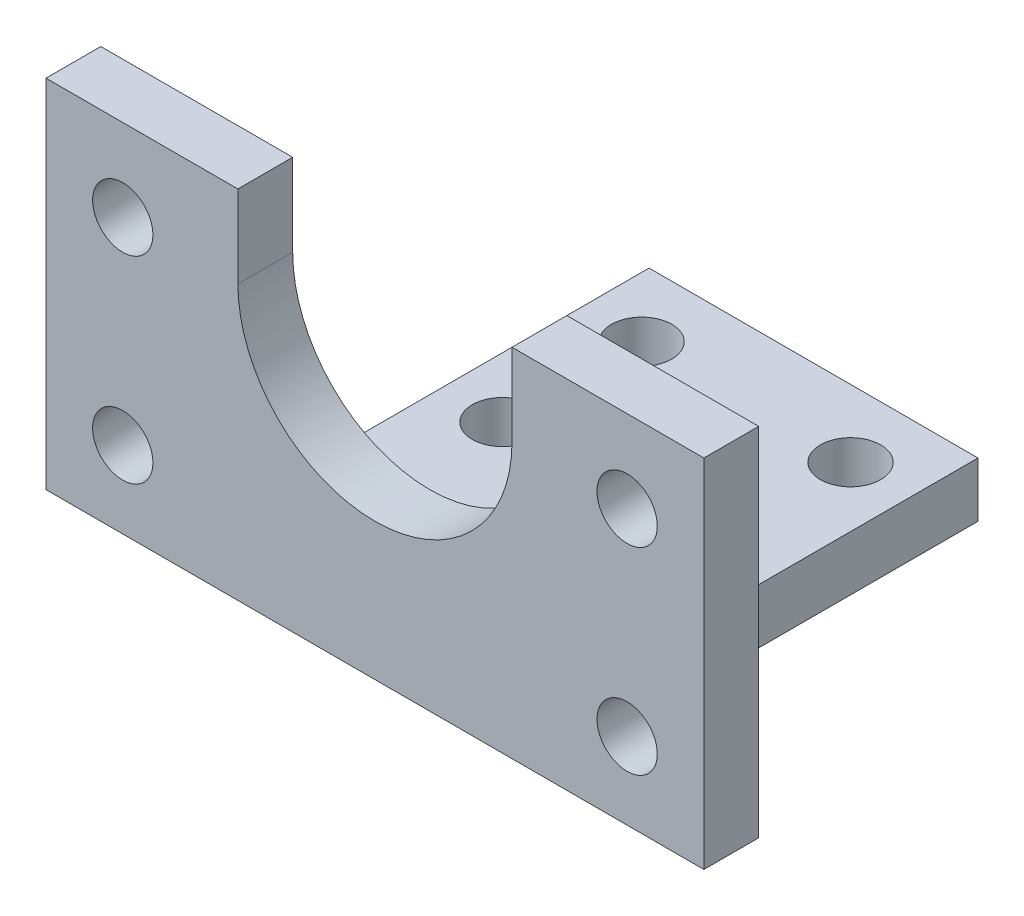
ISO-10303-21;
HEADER;
FILE_DESCRIPTION(('STEP AP214'),'2;1');
FILE_NAME('part.step','',(''),(''),'','','');
FILE_SCHEMA(('AUTOMOTIVE_DESIGN { 1 0 10303 214 1 1 1 1 }'));
ENDSEC;
DATA;
#1=APPLICATION_CONTEXT('core data for automotive mechanical design processes');
#2=APPLICATION_PROTOCOL_DEFINITION('international standard','automotive_design',2000,#1);
#3=PRODUCT_CONTEXT('',#1,'mechanical');
#4=PRODUCT('Part','Part','',(#3));
#5=PRODUCT_RELATED_PRODUCT_CATEGORY('part','',(#4));
#6=PRODUCT_DEFINITION_FORMATION('','',#4);
#7=PRODUCT_DEFINITION_CONTEXT('part definition',#1,'design');
#8=PRODUCT_DEFINITION('design','',#6,#7);
#9=PRODUCT_DEFINITION_SHAPE('','',#8);
#10=(LENGTH_UNIT() NAMED_UNIT(*) SI_UNIT(.MILLI.,.METRE.));
#11=(NAMED_UNIT(*) PLANE_ANGLE_UNIT() SI_UNIT($,.RADIAN.));
#12=(NAMED_UNIT(*) SI_UNIT($,.STERADIAN.) SOLID_ANGLE_UNIT());
#13=UNCERTAINTY_MEASURE_WITH_UNIT(LENGTH_MEASURE(1.E-05),#10,'distance_accuracy_value','');
#14=(GEOMETRIC_REPRESENTATION_CONTEXT(3) GLOBAL_UNCERTAINTY_ASSIGNED_CONTEXT((#13)) GLOBAL_UNIT_ASSIGNED_CONTEXT((#10,
#11,#12)) REPRESENTATION_CONTEXT('',''));
#15=CARTESIAN_POINT('',(0.,0.,0.));
#16=DIRECTION('',(0.,0.,1.));
#17=DIRECTION('',(1.,0.,0.));
#18=AXIS2_PLACEMENT_3D('',#15,#16,#17);
#19=CARTESIAN_POINT('',(30.,25.,5.));
#20=DIRECTION('',(0.,0.,-1.));
#21=DIRECTION('',(-1.,0.,0.));
#22=AXIS2_PLACEMENT_3D('',#19,#20,#21);
#23=CYLINDRICAL_SURFACE('',#22,12.5);
#24=CARTESIAN_POINT('',(30.,25.,0.));
#25=DIRECTION('',(0.,0.,1.));
#26=DIRECTION('',(1.,0.,0.));
#27=AXIS2_PLACEMENT_3D('',#24,#25,#26);
#28=CIRCLE('',#27,12.5);
#29=CARTESIAN_POINT('',(17.5,25.,0.));
#30=VERTEX_POINT('',#29);
#31=CARTESIAN_POINT('',(42.5,25.,0.));
#32=VERTEX_POINT('',#31);
#33=EDGE_CURVE('E324',#30,#32,#28,.T.);
#34=ORIENTED_EDGE('',*,*,#33,.F.);
#35=DIRECTION('',(0.,0.,-1.));
#36=VECTOR('',#35,1.);
#37=CARTESIAN_POINT('',(17.5,25.,5.));
#38=LINE('',#37,#36);
#39=CARTESIAN_POINT('',(17.5,25.,5.));
#40=VERTEX_POINT('',#39);
#41=EDGE_CURVE('E105',#40,#30,#38,.T.);
#42=ORIENTED_EDGE('',*,*,#41,.F.);
#43=CARTESIAN_POINT('',(30.,25.,5.));
#44=DIRECTION('',(0.,0.,1.));
#45=DIRECTION('',(1.,0.,0.));
#46=AXIS2_PLACEMENT_3D('',#43,#44,#45);
#47=CIRCLE('',#46,12.5);
#48=CARTESIAN_POINT('',(42.5,25.,5.));
#49=VERTEX_POINT('',#48);
#50=EDGE_CURVE('E169',#40,#49,#47,.T.);
#51=ORIENTED_EDGE('',*,*,#50,.T.);
#52=DIRECTION('',(0.,0.,-1.));
#53=VECTOR('',#52,1.);
#54=CARTESIAN_POINT('',(42.5,25.,5.));
#55=LINE('',#54,#53);
#56=EDGE_CURVE('E70',#49,#32,#55,.T.);
#57=ORIENTED_EDGE('',*,*,#56,.T.);
#58=EDGE_LOOP('',(#34,#42,#51,#57));
#59=FACE_BOUND('',#58,.T.);
#60=ADVANCED_FACE('F45',(#59),#23,.F.);
#61=CARTESIAN_POINT('',(17.5,0.,5.));
#62=DIRECTION('',(-1.,0.,0.));
#63=DIRECTION('',(0.,-1.,0.));
#64=AXIS2_PLACEMENT_3D('',#61,#62,#63);
#65=PLANE('',#64);
#66=DIRECTION('',(0.,1.,0.));
#67=VECTOR('',#66,1.);
#68=CARTESIAN_POINT('',(17.5,0.,0.));
#69=LINE('',#68,#67);
#70=CARTESIAN_POINT('',(17.5,32.5,0.));
#71=VERTEX_POINT('',#70);
#72=EDGE_CURVE('E327',#30,#71,#69,.T.);
#73=ORIENTED_EDGE('',*,*,#72,.T.);
#74=DIRECTION('',(0.,0.,-1.));
#75=VECTOR('',#74,1.);
#76=CARTESIAN_POINT('',(17.5,32.5,5.));
#77=LINE('',#76,#75);
#78=CARTESIAN_POINT('',(17.5,32.5,5.));
#79=VERTEX_POINT('',#78);
#80=EDGE_CURVE('E362',#79,#71,#77,.T.);
#81=ORIENTED_EDGE('',*,*,#80,.F.);
#82=DIRECTION('',(0.,1.,0.));
#83=VECTOR('',#82,1.);
#84=CARTESIAN_POINT('',(17.5,0.,5.));
#85=LINE('',#84,#83);
#86=EDGE_CURVE('E163',#40,#79,#85,.T.);
#87=ORIENTED_EDGE('',*,*,#86,.F.);
#88=ORIENTED_EDGE('',*,*,#41,.T.);
#89=EDGE_LOOP('',(#73,#81,#87,#88));
#90=FACE_BOUND('',#89,.T.);
#91=ADVANCED_FACE('F281',(#90),#65,.F.);
#92=CARTESIAN_POINT('',(0.,32.5,5.));
#93=DIRECTION('',(0.,1.,0.));
#94=DIRECTION('',(0.,0.,1.));
#95=AXIS2_PLACEMENT_3D('',#92,#93,#94);
#96=PLANE('',#95);
#97=DIRECTION('',(1.,0.,0.));
#98=VECTOR('',#97,1.);
#99=CARTESIAN_POINT('',(0.,32.5,0.));
#100=LINE('',#99,#98);
#101=CARTESIAN_POINT('',(0.,32.5,0.));
#102=VERTEX_POINT('',#101);
#103=EDGE_CURVE('E331',#102,#71,#100,.T.);
#104=ORIENTED_EDGE('',*,*,#103,.F.);
#105=DIRECTION('',(0.,0.,-1.));
#106=VECTOR('',#105,1.);
#107=CARTESIAN_POINT('',(0.,32.5,5.));
#108=LINE('',#107,#106);
#109=CARTESIAN_POINT('',(0.,32.5,5.));
#110=VERTEX_POINT('',#109);
#111=EDGE_CURVE('E359',#110,#102,#108,.T.);
#112=ORIENTED_EDGE('',*,*,#111,.F.);
#113=DIRECTION('',(1.,0.,0.));
#114=VECTOR('',#113,1.);
#115=CARTESIAN_POINT('',(0.,32.5,5.));
#116=LINE('',#115,#114);
#117=EDGE_CURVE('E155',#110,#79,#116,.T.);
#118=ORIENTED_EDGE('',*,*,#117,.T.);
#119=ORIENTED_EDGE('',*,*,#80,.T.);
#120=EDGE_LOOP('',(#104,#112,#118,#119));
#121=FACE_BOUND('',#120,.T.);
#122=ADVANCED_FACE('F276',(#121),#96,.T.);
#123=CARTESIAN_POINT('',(0.,0.,5.));
#124=DIRECTION('',(-1.,0.,0.));
#125=DIRECTION('',(0.,0.,1.));
#126=AXIS2_PLACEMENT_3D('',#123,#124,#125);
#127=PLANE('',#126);
#128=DIRECTION('',(0.,1.,0.));
#129=VECTOR('',#128,1.);
#130=CARTESIAN_POINT('',(0.,0.,0.));
#131=LINE('',#130,#129);
#132=CARTESIAN_POINT('',(0.,0.,0.));
#133=VERTEX_POINT('',#132);
#134=EDGE_CURVE('E335',#133,#102,#131,.T.);
#135=ORIENTED_EDGE('',*,*,#134,.F.);
#136=DIRECTION('',(0.,0.,-1.));
#137=VECTOR('',#136,1.);
#138=CARTESIAN_POINT('',(0.,0.,5.));
#139=LINE('',#138,#137);
#140=CARTESIAN_POINT('',(0.,0.,5.));
#141=VERTEX_POINT('',#140);
#142=EDGE_CURVE('E356',#141,#133,#139,.T.);
#143=ORIENTED_EDGE('',*,*,#142,.F.);
#144=DIRECTION('',(0.,1.,0.));
#145=VECTOR('',#144,1.);
#146=CARTESIAN_POINT('',(0.,0.,5.));
#147=LINE('',#146,#145);
#148=EDGE_CURVE('E162',#141,#110,#147,.T.);
#149=ORIENTED_EDGE('',*,*,#148,.T.);
#150=ORIENTED_EDGE('',*,*,#111,.T.);
#151=EDGE_LOOP('',(#135,#143,#149,#150));
#152=FACE_BOUND('',#151,.T.);
#153=ADVANCED_FACE('F267',(#152),#127,.T.);
#154=CARTESIAN_POINT('',(0.,0.,5.));
#155=DIRECTION('',(0.,1.,0.));
#156=DIRECTION('',(0.,0.,1.));
#157=AXIS2_PLACEMENT_3D('',#154,#155,#156);
#158=PLANE('',#157);
#159=DIRECTION('',(0.,0.,-1.));
#160=VECTOR('',#159,1.);
#161=CARTESIAN_POINT('',(60.,0.,5.));
#162=LINE('',#161,#160);
#163=CARTESIAN_POINT('',(60.,0.,5.));
#164=VERTEX_POINT('',#163);
#165=CARTESIAN_POINT('',(60.,0.,0.));
#166=VERTEX_POINT('',#165);
#167=EDGE_CURVE('E148',#164,#166,#162,.T.);
#168=ORIENTED_EDGE('',*,*,#167,.F.);
#169=DIRECTION('',(1.,0.,0.));
#170=VECTOR('',#169,1.);
#171=CARTESIAN_POINT('',(0.,0.,5.));
#172=LINE('',#171,#170);
#173=EDGE_CURVE('E133',#141,#164,#172,.T.);
#174=ORIENTED_EDGE('',*,*,#173,.F.);
#175=ORIENTED_EDGE('',*,*,#142,.T.);
#176=DIRECTION('',(1.,0.,0.));
#177=VECTOR('',#176,1.);
#178=CARTESIAN_POINT('',(0.,0.,0.));
#179=LINE('',#178,#177);
#180=CARTESIAN_POINT('',(15.,0.,0.));
#181=VERTEX_POINT('',#180);
#182=EDGE_CURVE('E341',#133,#181,#179,.T.);
#183=ORIENTED_EDGE('',*,*,#182,.T.);
#184=DIRECTION('',(0.,0.,-1.));
#185=VECTOR('',#184,1.);
#186=CARTESIAN_POINT('',(15.,0.,5.));
#187=LINE('',#186,#185);
#188=CARTESIAN_POINT('',(15.,0.,-35.));
#189=VERTEX_POINT('',#188);
#190=EDGE_CURVE('E208',#181,#189,#187,.T.);
#191=ORIENTED_EDGE('',*,*,#190,.T.);
#192=DIRECTION('',(1.,0.,0.));
#193=VECTOR('',#192,1.);
#194=CARTESIAN_POINT('',(15.,0.,-35.));
#195=LINE('',#194,#193);
#196=CARTESIAN_POINT('',(45.,0.,-35.));
#197=VERTEX_POINT('',#196);
#198=EDGE_CURVE('E205',#189,#197,#195,.T.);
#199=ORIENTED_EDGE('',*,*,#198,.T.);
#200=DIRECTION('',(0.,0.,1.));
#201=VECTOR('',#200,1.);
#202=CARTESIAN_POINT('',(45.,0.,-35.));
#203=LINE('',#202,#201);
#204=CARTESIAN_POINT('',(45.,0.,0.));
#205=VERTEX_POINT('',#204);
#206=EDGE_CURVE('E61',#197,#205,#203,.T.);
#207=ORIENTED_EDGE('',*,*,#206,.T.);
#208=EDGE_CURVE('E340',#205,#166,#179,.T.);
#209=ORIENTED_EDGE('',*,*,#208,.T.);
#210=EDGE_LOOP('',(#168,#174,#175,#183,#191,#199,#207,#209));
#211=FACE_BOUND('',#210,.T.);
#212=CARTESIAN_POINT('',(39.525,0.,-16.15));
#213=DIRECTION('',(0.,-1.,0.));
#214=DIRECTION('',(0.,0.,-1.));
#215=AXIS2_PLACEMENT_3D('',#212,#213,#214);
#216=CIRCLE('',#215,2.75);
#217=CARTESIAN_POINT('',(39.525,0.,-18.9));
#218=VERTEX_POINT('',#217);
#219=EDGE_CURVE('E223',#218,#218,#216,.T.);
#220=ORIENTED_EDGE('',*,*,#219,.F.);
#221=EDGE_LOOP('',(#220));
#222=FACE_BOUND('',#221,.T.);
#223=CARTESIAN_POINT('',(39.525,0.,-28.85));
#224=DIRECTION('',(0.,-1.,0.));
#225=DIRECTION('',(0.,0.,-1.));
#226=AXIS2_PLACEMENT_3D('',#223,#224,#225);
#227=CIRCLE('',#226,2.75);
#228=CARTESIAN_POINT('',(39.525,0.,-31.6));
#229=VERTEX_POINT('',#228);
#230=EDGE_CURVE('E231',#229,#229,#227,.T.);
#231=ORIENTED_EDGE('',*,*,#230,.F.);
#232=EDGE_LOOP('',(#231));
#233=FACE_BOUND('',#232,.T.);
#234=CARTESIAN_POINT('',(20.475,0.,-28.85));
#235=DIRECTION('',(0.,-1.,0.));
#236=DIRECTION('',(0.,0.,-1.));
#237=AXIS2_PLACEMENT_3D('',#234,#235,#236);
#238=CIRCLE('',#237,2.75);
#239=CARTESIAN_POINT('',(20.475,0.,-31.6));
#240=VERTEX_POINT('',#239);
#241=EDGE_CURVE('E239',#240,#240,#238,.T.);
#242=ORIENTED_EDGE('',*,*,#241,.F.);
#243=EDGE_LOOP('',(#242));
#244=FACE_BOUND('',#243,.T.);
#245=CARTESIAN_POINT('',(20.475,0.,-16.15));
#246=DIRECTION('',(0.,-1.,0.));
#247=DIRECTION('',(0.,0.,-1.));
#248=AXIS2_PLACEMENT_3D('',#245,#246,#247);
#249=CIRCLE('',#248,2.75);
#250=CARTESIAN_POINT('',(20.475,0.,-18.9));
#251=VERTEX_POINT('',#250);
#252=EDGE_CURVE('E247',#251,#251,#249,.T.);
#253=ORIENTED_EDGE('',*,*,#252,.F.);
#254=EDGE_LOOP('',(#253));
#255=FACE_BOUND('',#254,.T.);
#256=ADVANCED_FACE('F265',(#211,#222,#233,#244,#255),#158,.F.);
#257=CARTESIAN_POINT('',(60.,0.,5.));
#258=DIRECTION('',(-1.,0.,0.));
#259=DIRECTION('',(0.,0.,1.));
#260=AXIS2_PLACEMENT_3D('',#257,#258,#259);
#261=PLANE('',#260);
#262=DIRECTION('',(0.,1.,0.));
#263=VECTOR('',#262,1.);
#264=CARTESIAN_POINT('',(60.,0.,0.));
#265=LINE('',#264,#263);
#266=CARTESIAN_POINT('',(60.,32.5,0.));
#267=VERTEX_POINT('',#266);
#268=EDGE_CURVE('E143',#166,#267,#265,.T.);
#269=ORIENTED_EDGE('',*,*,#268,.T.);
#270=DIRECTION('',(0.,0.,-1.));
#271=VECTOR('',#270,1.);
#272=CARTESIAN_POINT('',(60.,32.5,5.));
#273=LINE('',#272,#271);
#274=CARTESIAN_POINT('',(60.,32.5,5.));
#275=VERTEX_POINT('',#274);
#276=EDGE_CURVE('E140',#275,#267,#273,.T.);
#277=ORIENTED_EDGE('',*,*,#276,.F.);
#278=DIRECTION('',(0.,1.,0.));
#279=VECTOR('',#278,1.);
#280=CARTESIAN_POINT('',(60.,0.,5.));
#281=LINE('',#280,#279);
#282=EDGE_CURVE('E124',#164,#275,#281,.T.);
#283=ORIENTED_EDGE('',*,*,#282,.F.);
#284=ORIENTED_EDGE('',*,*,#167,.T.);
#285=EDGE_LOOP('',(#269,#277,#283,#284));
#286=FACE_BOUND('',#285,.T.);
#287=ADVANCED_FACE('F141',(#286),#261,.F.);
#288=CARTESIAN_POINT('',(42.5,32.5,0.));
#289=VERTEX_POINT('',#288);
#290=EDGE_CURVE('E336',#289,#267,#100,.T.);
#291=ORIENTED_EDGE('',*,*,#290,.F.);
#292=DIRECTION('',(0.,0.,-1.));
#293=VECTOR('',#292,1.);
#294=CARTESIAN_POINT('',(42.5,32.5,5.));
#295=LINE('',#294,#293);
#296=CARTESIAN_POINT('',(42.5,32.5,5.));
#297=VERTEX_POINT('',#296);
#298=EDGE_CURVE('E149',#297,#289,#295,.T.);
#299=ORIENTED_EDGE('',*,*,#298,.F.);
#300=EDGE_CURVE('E130',#297,#275,#116,.T.);
#301=ORIENTED_EDGE('',*,*,#300,.T.);
#302=ORIENTED_EDGE('',*,*,#276,.T.);
#303=EDGE_LOOP('',(#291,#299,#301,#302));
#304=FACE_BOUND('',#303,.T.);
#305=ADVANCED_FACE('F151',(#304),#96,.T.);
#306=CARTESIAN_POINT('',(53.,25.,5.));
#307=DIRECTION('',(0.,0.,-1.));
#308=DIRECTION('',(-1.,0.,0.));
#309=AXIS2_PLACEMENT_3D('',#306,#307,#308);
#310=CYLINDRICAL_SURFACE('',#309,2.75);
#311=CARTESIAN_POINT('',(53.,25.,5.));
#312=DIRECTION('',(0.,0.,1.));
#313=DIRECTION('',(1.,0.,0.));
#314=AXIS2_PLACEMENT_3D('',#311,#312,#313);
#315=CIRCLE('',#314,2.75);
#316=CARTESIAN_POINT('',(55.75,25.,5.));
#317=VERTEX_POINT('',#316);
#318=EDGE_CURVE('E173',#317,#317,#315,.T.);
#319=ORIENTED_EDGE('',*,*,#318,.T.);
#320=EDGE_LOOP('',(#319));
#321=FACE_BOUND('',#320,.T.);
#322=CARTESIAN_POINT('',(53.,25.,0.));
#323=DIRECTION('',(0.,0.,1.));
#324=DIRECTION('',(1.,0.,0.));
#325=AXIS2_PLACEMENT_3D('',#322,#323,#324);
#326=CIRCLE('',#325,2.75);
#327=CARTESIAN_POINT('',(55.75,25.,0.));
#328=VERTEX_POINT('',#327);
#329=EDGE_CURVE('E316',#328,#328,#326,.T.);
#330=ORIENTED_EDGE('',*,*,#329,.F.);
#331=EDGE_LOOP('',(#330));
#332=FACE_BOUND('',#331,.T.);
#333=ADVANCED_FACE('F289',(#321,#332),#310,.F.);
#334=CARTESIAN_POINT('',(53.,7.,5.));
#335=DIRECTION('',(0.,0.,-1.));
#336=DIRECTION('',(-1.,0.,0.));
#337=AXIS2_PLACEMENT_3D('',#334,#335,#336);
#338=CYLINDRICAL_SURFACE('',#337,2.75);
#339=CARTESIAN_POINT('',(53.,7.,5.));
#340=DIRECTION('',(0.,0.,1.));
#341=DIRECTION('',(1.,0.,0.));
#342=AXIS2_PLACEMENT_3D('',#339,#340,#341);
#343=CIRCLE('',#342,2.75);
#344=CARTESIAN_POINT('',(55.75,7.,5.));
#345=VERTEX_POINT('',#344);
#346=EDGE_CURVE('E179',#345,#345,#343,.T.);
#347=ORIENTED_EDGE('',*,*,#346,.T.);
#348=EDGE_LOOP('',(#347));
#349=FACE_BOUND('',#348,.T.);
#350=CARTESIAN_POINT('',(53.,7.,0.));
#351=DIRECTION('',(0.,0.,1.));
#352=DIRECTION('',(1.,0.,0.));
#353=AXIS2_PLACEMENT_3D('',#350,#351,#352);
#354=CIRCLE('',#353,2.75);
#355=CARTESIAN_POINT('',(55.75,7.,0.));
#356=VERTEX_POINT('',#355);
#357=EDGE_CURVE('E311',#356,#356,#354,.T.);
#358=ORIENTED_EDGE('',*,*,#357,.F.);
#359=EDGE_LOOP('',(#358));
#360=FACE_BOUND('',#359,.T.);
#361=ADVANCED_FACE('F292',(#349,#360),#338,.F.);
#362=CARTESIAN_POINT('',(7.,6.99999999999999,5.));
#363=DIRECTION('',(0.,0.,-1.));
#364=DIRECTION('',(-1.,0.,0.));
#365=AXIS2_PLACEMENT_3D('',#362,#363,#364);
#366=CYLINDRICAL_SURFACE('',#365,2.75);
#367=CARTESIAN_POINT('',(7.,6.99999999999999,5.));
#368=DIRECTION('',(0.,0.,1.));
#369=DIRECTION('',(1.,0.,0.));
#370=AXIS2_PLACEMENT_3D('',#367,#368,#369);
#371=CIRCLE('',#370,2.75);
#372=CARTESIAN_POINT('',(9.75,6.99999999999999,5.));
#373=VERTEX_POINT('',#372);
#374=EDGE_CURVE('E183',#373,#373,#371,.T.);
#375=ORIENTED_EDGE('',*,*,#374,.T.);
#376=EDGE_LOOP('',(#375));
#377=FACE_BOUND('',#376,.T.);
#378=CARTESIAN_POINT('',(7.,6.99999999999999,0.));
#379=DIRECTION('',(0.,0.,1.));
#380=DIRECTION('',(1.,0.,0.));
#381=AXIS2_PLACEMENT_3D('',#378,#379,#380);
#382=CIRCLE('',#381,2.75);
#383=CARTESIAN_POINT('',(9.75,6.99999999999999,0.));
#384=VERTEX_POINT('',#383);
#385=EDGE_CURVE('E308',#384,#384,#382,.T.);
#386=ORIENTED_EDGE('',*,*,#385,.F.);
#387=EDGE_LOOP('',(#386));
#388=FACE_BOUND('',#387,.T.);
#389=ADVANCED_FACE('F295',(#377,#388),#366,.F.);
#390=CARTESIAN_POINT('',(7.,25.,5.));
#391=DIRECTION('',(0.,0.,-1.));
#392=DIRECTION('',(-1.,0.,0.));
#393=AXIS2_PLACEMENT_3D('',#390,#391,#392);
#394=CYLINDRICAL_SURFACE('',#393,2.75);
#395=CARTESIAN_POINT('',(7.,25.,5.));
#396=DIRECTION('',(0.,0.,1.));
#397=DIRECTION('',(1.,0.,0.));
#398=AXIS2_PLACEMENT_3D('',#395,#396,#397);
#399=CIRCLE('',#398,2.75);
#400=CARTESIAN_POINT('',(9.75,25.,5.));
#401=VERTEX_POINT('',#400);
#402=EDGE_CURVE('E187',#401,#401,#399,.T.);
#403=ORIENTED_EDGE('',*,*,#402,.T.);
#404=EDGE_LOOP('',(#403));
#405=FACE_BOUND('',#404,.T.);
#406=CARTESIAN_POINT('',(7.,25.,0.));
#407=DIRECTION('',(0.,0.,1.));
#408=DIRECTION('',(1.,0.,0.));
#409=AXIS2_PLACEMENT_3D('',#406,#407,#408);
#410=CIRCLE('',#409,2.75);
#411=CARTESIAN_POINT('',(9.75,25.,0.));
#412=VERTEX_POINT('',#411);
#413=EDGE_CURVE('E201',#412,#412,#410,.T.);
#414=ORIENTED_EDGE('',*,*,#413,.F.);
#415=EDGE_LOOP('',(#414));
#416=FACE_BOUND('',#415,.T.);
#417=ADVANCED_FACE('F47',(#405,#416),#394,.F.);
#418=CARTESIAN_POINT('',(42.5,0.,5.));
#419=DIRECTION('',(-1.,0.,0.));
#420=DIRECTION('',(0.,-1.,0.));
#421=AXIS2_PLACEMENT_3D('',#418,#419,#420);
#422=PLANE('',#421);
#423=DIRECTION('',(0.,1.,0.));
#424=VECTOR('',#423,1.);
#425=CARTESIAN_POINT('',(42.5,0.,0.));
#426=LINE('',#425,#424);
#427=EDGE_CURVE('E191',#32,#289,#426,.T.);
#428=ORIENTED_EDGE('',*,*,#427,.F.);
#429=ORIENTED_EDGE('',*,*,#56,.F.);
#430=DIRECTION('',(0.,1.,0.));
#431=VECTOR('',#430,1.);
#432=CARTESIAN_POINT('',(42.5,0.,5.));
#433=LINE('',#432,#431);
#434=EDGE_CURVE('E153',#49,#297,#433,.T.);
#435=ORIENTED_EDGE('',*,*,#434,.T.);
#436=ORIENTED_EDGE('',*,*,#298,.T.);
#437=EDGE_LOOP('',(#428,#429,#435,#436));
#438=FACE_BOUND('',#437,.T.);
#439=ADVANCED_FACE('F302',(#438),#422,.T.);
#440=CARTESIAN_POINT('',(0.,0.,5.));
#441=DIRECTION('',(0.,0.,1.));
#442=DIRECTION('',(1.,0.,0.));
#443=AXIS2_PLACEMENT_3D('',#440,#441,#442);
#444=PLANE('',#443);
#445=ORIENTED_EDGE('',*,*,#173,.T.);
#446=ORIENTED_EDGE('',*,*,#282,.T.);
#447=ORIENTED_EDGE('',*,*,#300,.F.);
#448=ORIENTED_EDGE('',*,*,#434,.F.);
#449=ORIENTED_EDGE('',*,*,#50,.F.);
#450=ORIENTED_EDGE('',*,*,#86,.T.);
#451=ORIENTED_EDGE('',*,*,#117,.F.);
#452=ORIENTED_EDGE('',*,*,#148,.F.);
#453=EDGE_LOOP('',(#445,#446,#447,#448,#449,#450,#451,#452));
#454=FACE_BOUND('',#453,.T.);
#455=ORIENTED_EDGE('',*,*,#402,.F.);
#456=EDGE_LOOP('',(#455));
#457=FACE_BOUND('',#456,.T.);
#458=ORIENTED_EDGE('',*,*,#374,.F.);
#459=EDGE_LOOP('',(#458));
#460=FACE_BOUND('',#459,.T.);
#461=ORIENTED_EDGE('',*,*,#346,.F.);
#462=EDGE_LOOP('',(#461));
#463=FACE_BOUND('',#462,.T.);
#464=ORIENTED_EDGE('',*,*,#318,.F.);
#465=EDGE_LOOP('',(#464));
#466=FACE_BOUND('',#465,.T.);
#467=ADVANCED_FACE('F126',(#454,#457,#460,#463,#466),#444,.T.);
#468=CARTESIAN_POINT('',(0.,0.,0.));
#469=DIRECTION('',(0.,0.,1.));
#470=DIRECTION('',(1.,0.,0.));
#471=AXIS2_PLACEMENT_3D('',#468,#469,#470);
#472=PLANE('',#471);
#473=ORIENTED_EDGE('',*,*,#413,.T.);
#474=EDGE_LOOP('',(#473));
#475=FACE_BOUND('',#474,.T.);
#476=ORIENTED_EDGE('',*,*,#385,.T.);
#477=EDGE_LOOP('',(#476));
#478=FACE_BOUND('',#477,.T.);
#479=ORIENTED_EDGE('',*,*,#357,.T.);
#480=EDGE_LOOP('',(#479));
#481=FACE_BOUND('',#480,.T.);
#482=ORIENTED_EDGE('',*,*,#329,.T.);
#483=EDGE_LOOP('',(#482));
#484=FACE_BOUND('',#483,.T.);
#485=DIRECTION('',(1.,0.,0.));
#486=VECTOR('',#485,1.);
#487=CARTESIAN_POINT('',(0.,5.,0.));
#488=LINE('',#487,#486);
#489=CARTESIAN_POINT('',(15.,5.,0.));
#490=VERTEX_POINT('',#489);
#491=CARTESIAN_POINT('',(45.,5.,0.));
#492=VERTEX_POINT('',#491);
#493=EDGE_CURVE('E367',#490,#492,#488,.T.);
#494=ORIENTED_EDGE('',*,*,#493,.F.);
#495=DIRECTION('',(0.,-1.,0.));
#496=VECTOR('',#495,1.);
#497=CARTESIAN_POINT('',(15.,0.,0.));
#498=LINE('',#497,#496);
#499=EDGE_CURVE('E11',#490,#181,#498,.T.);
#500=ORIENTED_EDGE('',*,*,#499,.T.);
#501=ORIENTED_EDGE('',*,*,#182,.F.);
#502=ORIENTED_EDGE('',*,*,#134,.T.);
#503=ORIENTED_EDGE('',*,*,#103,.T.);
#504=ORIENTED_EDGE('',*,*,#72,.F.);
#505=ORIENTED_EDGE('',*,*,#33,.T.);
#506=ORIENTED_EDGE('',*,*,#427,.T.);
#507=ORIENTED_EDGE('',*,*,#290,.T.);
#508=ORIENTED_EDGE('',*,*,#268,.F.);
#509=ORIENTED_EDGE('',*,*,#208,.F.);
#510=DIRECTION('',(0.,1.,0.));
#511=VECTOR('',#510,1.);
#512=CARTESIAN_POINT('',(45.,0.,0.));
#513=LINE('',#512,#511);
#514=EDGE_CURVE('E54',#205,#492,#513,.T.);
#515=ORIENTED_EDGE('',*,*,#514,.T.);
#516=EDGE_LOOP('',(#494,#500,#501,#502,#503,#504,#505,#506,#507,#508,#509,#515));
#517=FACE_BOUND('',#516,.T.);
#518=ADVANCED_FACE('F375',(#475,#478,#481,#484,#517),#472,.F.);
#519=CARTESIAN_POINT('',(15.,5.,5.));
#520=DIRECTION('',(-1.,0.,0.));
#521=DIRECTION('',(0.,0.,1.));
#522=AXIS2_PLACEMENT_3D('',#519,#520,#521);
#523=PLANE('',#522);
#524=ORIENTED_EDGE('',*,*,#499,.F.);
#525=DIRECTION('',(0.,0.,-1.));
#526=VECTOR('',#525,1.);
#527=CARTESIAN_POINT('',(15.,5.,5.));
#528=LINE('',#527,#526);
#529=CARTESIAN_POINT('',(15.,5.,-35.));
#530=VERTEX_POINT('',#529);
#531=EDGE_CURVE('E204',#490,#530,#528,.T.);
#532=ORIENTED_EDGE('',*,*,#531,.T.);
#533=DIRECTION('',(0.,-1.,0.));
#534=VECTOR('',#533,1.);
#535=CARTESIAN_POINT('',(15.,5.,-35.));
#536=LINE('',#535,#534);
#537=EDGE_CURVE('E192',#530,#189,#536,.T.);
#538=ORIENTED_EDGE('',*,*,#537,.T.);
#539=ORIENTED_EDGE('',*,*,#190,.F.);
#540=EDGE_LOOP('',(#524,#532,#538,#539));
#541=FACE_BOUND('',#540,.T.);
#542=ADVANCED_FACE('F398',(#541),#523,.T.);
#543=CARTESIAN_POINT('',(45.,5.,-35.));
#544=DIRECTION('',(1.,0.,0.));
#545=DIRECTION('',(0.,0.,-1.));
#546=AXIS2_PLACEMENT_3D('',#543,#544,#545);
#547=PLANE('',#546);
#548=ORIENTED_EDGE('',*,*,#514,.F.);
#549=ORIENTED_EDGE('',*,*,#206,.F.);
#550=DIRECTION('',(0.,-1.,0.));
#551=VECTOR('',#550,1.);
#552=CARTESIAN_POINT('',(45.,5.,-35.));
#553=LINE('',#552,#551);
#554=CARTESIAN_POINT('',(45.,5.,-35.));
#555=VERTEX_POINT('',#554);
#556=EDGE_CURVE('E196',#555,#197,#553,.T.);
#557=ORIENTED_EDGE('',*,*,#556,.F.);
#558=DIRECTION('',(0.,0.,1.));
#559=VECTOR('',#558,1.);
#560=CARTESIAN_POINT('',(45.,5.,-35.));
#561=LINE('',#560,#559);
#562=EDGE_CURVE('E197',#555,#492,#561,.T.);
#563=ORIENTED_EDGE('',*,*,#562,.T.);
#564=EDGE_LOOP('',(#548,#549,#557,#563));
#565=FACE_BOUND('',#564,.T.);
#566=ADVANCED_FACE('F378',(#565),#547,.T.);
#567=CARTESIAN_POINT('',(0.,5.,0.));
#568=DIRECTION('',(0.,-1.,0.));
#569=DIRECTION('',(0.,0.,-1.));
#570=AXIS2_PLACEMENT_3D('',#567,#568,#569);
#571=PLANE('',#570);
#572=CARTESIAN_POINT('',(20.475,5.,-16.15));
#573=DIRECTION('',(0.,-1.,0.));
#574=DIRECTION('',(0.,0.,-1.));
#575=AXIS2_PLACEMENT_3D('',#572,#573,#574);
#576=CIRCLE('',#575,2.75);
#577=CARTESIAN_POINT('',(20.475,5.,-18.9));
#578=VERTEX_POINT('',#577);
#579=EDGE_CURVE('E243',#578,#578,#576,.T.);
#580=ORIENTED_EDGE('',*,*,#579,.T.);
#581=EDGE_LOOP('',(#580));
#582=FACE_BOUND('',#581,.T.);
#583=CARTESIAN_POINT('',(20.475,5.,-28.85));
#584=DIRECTION('',(0.,-1.,0.));
#585=DIRECTION('',(0.,0.,-1.));
#586=AXIS2_PLACEMENT_3D('',#583,#584,#585);
#587=CIRCLE('',#586,2.75);
#588=CARTESIAN_POINT('',(20.475,5.,-31.6));
#589=VERTEX_POINT('',#588);
#590=EDGE_CURVE('E235',#589,#589,#587,.T.);
#591=ORIENTED_EDGE('',*,*,#590,.T.);
#592=EDGE_LOOP('',(#591));
#593=FACE_BOUND('',#592,.T.);
#594=CARTESIAN_POINT('',(39.525,5.,-28.85));
#595=DIRECTION('',(0.,-1.,0.));
#596=DIRECTION('',(0.,0.,-1.));
#597=AXIS2_PLACEMENT_3D('',#594,#595,#596);
#598=CIRCLE('',#597,2.75);
#599=CARTESIAN_POINT('',(39.525,5.,-31.6));
#600=VERTEX_POINT('',#599);
#601=EDGE_CURVE('E227',#600,#600,#598,.T.);
#602=ORIENTED_EDGE('',*,*,#601,.T.);
#603=EDGE_LOOP('',(#602));
#604=FACE_BOUND('',#603,.T.);
#605=CARTESIAN_POINT('',(39.525,5.,-16.15));
#606=DIRECTION('',(0.,-1.,0.));
#607=DIRECTION('',(0.,0.,-1.));
#608=AXIS2_PLACEMENT_3D('',#605,#606,#607);
#609=CIRCLE('',#608,2.75);
#610=CARTESIAN_POINT('',(39.525,5.,-18.9));
#611=VERTEX_POINT('',#610);
#612=EDGE_CURVE('E212',#611,#611,#609,.T.);
#613=ORIENTED_EDGE('',*,*,#612,.T.);
#614=EDGE_LOOP('',(#613));
#615=FACE_BOUND('',#614,.T.);
#616=ORIENTED_EDGE('',*,*,#531,.F.);
#617=ORIENTED_EDGE('',*,*,#493,.T.);
#618=ORIENTED_EDGE('',*,*,#562,.F.);
#619=DIRECTION('',(1.,0.,0.));
#620=VECTOR('',#619,1.);
#621=CARTESIAN_POINT('',(15.,5.,-35.));
#622=LINE('',#621,#620);
#623=EDGE_CURVE('E216',#530,#555,#622,.T.);
#624=ORIENTED_EDGE('',*,*,#623,.F.);
#625=EDGE_LOOP('',(#616,#617,#618,#624));
#626=FACE_BOUND('',#625,.T.);
#627=ADVANCED_FACE('F255',(#582,#593,#604,#615,#626),#571,.F.);
#628=CARTESIAN_POINT('',(15.,5.,-35.));
#629=DIRECTION('',(0.,0.,-1.));
#630=DIRECTION('',(-1.,0.,0.));
#631=AXIS2_PLACEMENT_3D('',#628,#629,#630);
#632=PLANE('',#631);
#633=ORIENTED_EDGE('',*,*,#198,.F.);
#634=ORIENTED_EDGE('',*,*,#537,.F.);
#635=ORIENTED_EDGE('',*,*,#623,.T.);
#636=ORIENTED_EDGE('',*,*,#556,.T.);
#637=EDGE_LOOP('',(#633,#634,#635,#636));
#638=FACE_BOUND('',#637,.T.);
#639=ADVANCED_FACE('F392',(#638),#632,.T.);
#640=CARTESIAN_POINT('',(39.525,5.,-16.15));
#641=DIRECTION('',(0.,-1.,0.));
#642=DIRECTION('',(0.,0.,-1.));
#643=AXIS2_PLACEMENT_3D('',#640,#641,#642);
#644=CYLINDRICAL_SURFACE('',#643,2.75);
#645=ORIENTED_EDGE('',*,*,#612,.F.);
#646=EDGE_LOOP('',(#645));
#647=FACE_BOUND('',#646,.T.);
#648=ORIENTED_EDGE('',*,*,#219,.T.);
#649=EDGE_LOOP('',(#648));
#650=FACE_BOUND('',#649,.T.);
#651=ADVANCED_FACE('F516',(#647,#650),#644,.F.);
#652=CARTESIAN_POINT('',(39.525,5.,-28.85));
#653=DIRECTION('',(0.,-1.,0.));
#654=DIRECTION('',(0.,0.,-1.));
#655=AXIS2_PLACEMENT_3D('',#652,#653,#654);
#656=CYLINDRICAL_SURFACE('',#655,2.75);
#657=ORIENTED_EDGE('',*,*,#601,.F.);
#658=EDGE_LOOP('',(#657));
#659=FACE_BOUND('',#658,.T.);
#660=ORIENTED_EDGE('',*,*,#230,.T.);
#661=EDGE_LOOP('',(#660));
#662=FACE_BOUND('',#661,.T.);
#663=ADVANCED_FACE('F525',(#659,#662),#656,.F.);
#664=CARTESIAN_POINT('',(20.475,5.,-28.85));
#665=DIRECTION('',(0.,-1.,0.));
#666=DIRECTION('',(0.,0.,-1.));
#667=AXIS2_PLACEMENT_3D('',#664,#665,#666);
#668=CYLINDRICAL_SURFACE('',#667,2.75);
#669=ORIENTED_EDGE('',*,*,#590,.F.);
#670=EDGE_LOOP('',(#669));
#671=FACE_BOUND('',#670,.T.);
#672=ORIENTED_EDGE('',*,*,#241,.T.);
#673=EDGE_LOOP('',(#672));
#674=FACE_BOUND('',#673,.T.);
#675=ADVANCED_FACE('F261',(#671,#674),#668,.F.);
#676=CARTESIAN_POINT('',(20.475,5.,-16.15));
#677=DIRECTION('',(0.,-1.,0.));
#678=DIRECTION('',(0.,0.,-1.));
#679=AXIS2_PLACEMENT_3D('',#676,#677,#678);
#680=CYLINDRICAL_SURFACE('',#679,2.75);
#681=ORIENTED_EDGE('',*,*,#579,.F.);
#682=EDGE_LOOP('',(#681));
#683=FACE_BOUND('',#682,.T.);
#684=ORIENTED_EDGE('',*,*,#252,.T.);
#685=EDGE_LOOP('',(#684));
#686=FACE_BOUND('',#685,.T.);
#687=ADVANCED_FACE('F258',(#683,#686),#680,.F.);
#688=CLOSED_SHELL('',(#60,#91,#122,#153,#256,#287,#305,#333,#361,#389,#417,#439,#467,#518,#542,
#566,#627,#639,#651,#663,#675,#687));
#689=MANIFOLD_SOLID_BREP('B2',#688);
#690=ADVANCED_BREP_SHAPE_REPRESENTATION('',(#18,#689),#14);
#691=SHAPE_DEFINITION_REPRESENTATION(#9,#690);
ENDSEC;
END-ISO-10303-21;
